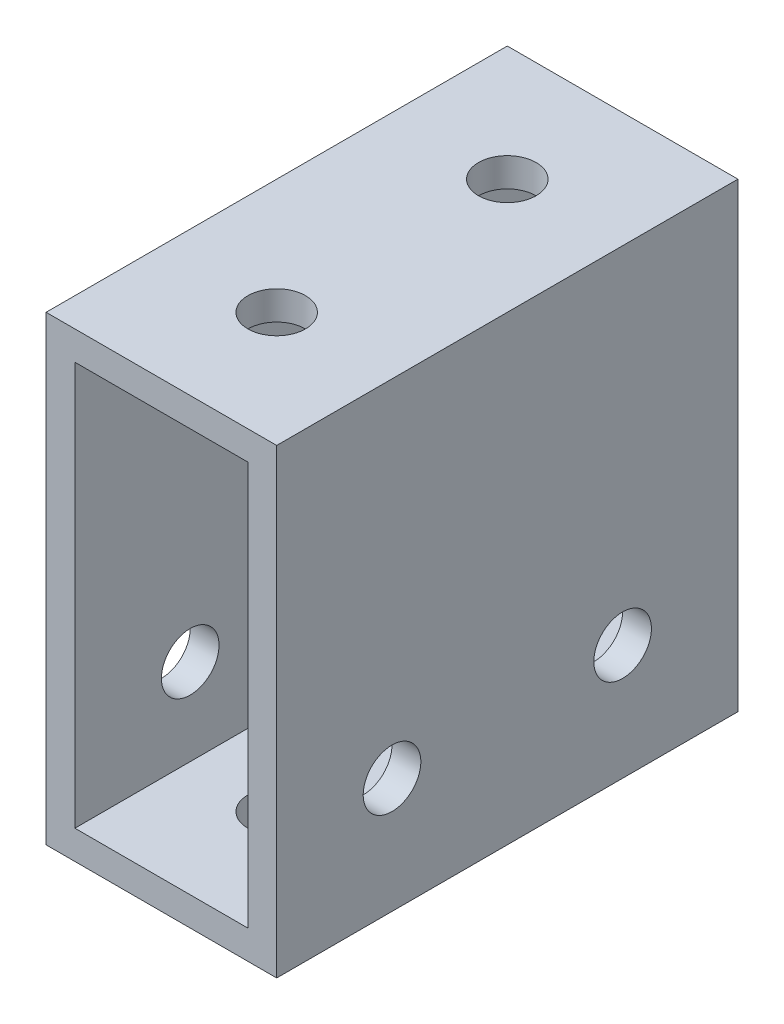
ISO-10303-21;
HEADER;
FILE_DESCRIPTION(('STEP AP214'),'2;1');
FILE_NAME('part.step','',(''),(''),'','','');
FILE_SCHEMA(('AUTOMOTIVE_DESIGN { 1 0 10303 214 1 1 1 1 }'));
ENDSEC;
DATA;
#1=APPLICATION_CONTEXT('core data for automotive mechanical design processes');
#2=APPLICATION_PROTOCOL_DEFINITION('international standard','automotive_design',2000,#1);
#3=PRODUCT_CONTEXT('',#1,'mechanical');
#4=PRODUCT('Part','Part','',(#3));
#5=PRODUCT_RELATED_PRODUCT_CATEGORY('part','',(#4));
#6=PRODUCT_DEFINITION_FORMATION('','',#4);
#7=PRODUCT_DEFINITION_CONTEXT('part definition',#1,'design');
#8=PRODUCT_DEFINITION('design','',#6,#7);
#9=PRODUCT_DEFINITION_SHAPE('','',#8);
#10=(LENGTH_UNIT() NAMED_UNIT(*) SI_UNIT(.MILLI.,.METRE.));
#11=(NAMED_UNIT(*) PLANE_ANGLE_UNIT() SI_UNIT($,.RADIAN.));
#12=(NAMED_UNIT(*) SI_UNIT($,.STERADIAN.) SOLID_ANGLE_UNIT());
#13=UNCERTAINTY_MEASURE_WITH_UNIT(LENGTH_MEASURE(1.E-05),#10,'distance_accuracy_value','');
#14=(GEOMETRIC_REPRESENTATION_CONTEXT(3) GLOBAL_UNCERTAINTY_ASSIGNED_CONTEXT((#13)) GLOBAL_UNIT_ASSIGNED_CONTEXT((#10,
#11,#12)) REPRESENTATION_CONTEXT('',''));
#15=CARTESIAN_POINT('',(0.,0.,0.));
#16=DIRECTION('',(0.,0.,1.));
#17=DIRECTION('',(1.,0.,0.));
#18=AXIS2_PLACEMENT_3D('',#15,#16,#17);
#19=CARTESIAN_POINT('',(0.,0.,50.8));
#20=DIRECTION('',(0.,0.,-1.));
#21=DIRECTION('',(-1.,0.,0.));
#22=AXIS2_PLACEMENT_3D('',#19,#20,#21);
#23=PLANE('',#22);
#24=DIRECTION('',(0.,-1.,0.));
#25=VECTOR('',#24,1.);
#26=CARTESIAN_POINT('',(0.,0.,50.8));
#27=LINE('',#26,#25);
#28=CARTESIAN_POINT('',(0.,50.8,50.8));
#29=VERTEX_POINT('',#28);
#30=CARTESIAN_POINT('',(0.,0.,50.8));
#31=VERTEX_POINT('',#30);
#32=EDGE_CURVE('E138',#29,#31,#27,.T.);
#33=ORIENTED_EDGE('',*,*,#32,.T.);
#34=DIRECTION('',(1.,0.,0.));
#35=VECTOR('',#34,1.);
#36=CARTESIAN_POINT('',(0.,0.,50.8));
#37=LINE('',#36,#35);
#38=CARTESIAN_POINT('',(25.4,0.,50.8));
#39=VERTEX_POINT('',#38);
#40=EDGE_CURVE('E141',#31,#39,#37,.T.);
#41=ORIENTED_EDGE('',*,*,#40,.T.);
#42=DIRECTION('',(0.,1.,0.));
#43=VECTOR('',#42,1.);
#44=CARTESIAN_POINT('',(25.4,0.,50.8));
#45=LINE('',#44,#43);
#46=CARTESIAN_POINT('',(25.4,50.8,50.8));
#47=VERTEX_POINT('',#46);
#48=EDGE_CURVE('E144',#39,#47,#45,.T.);
#49=ORIENTED_EDGE('',*,*,#48,.T.);
#50=DIRECTION('',(-1.,0.,0.));
#51=VECTOR('',#50,1.);
#52=CARTESIAN_POINT('',(0.,50.8,50.8));
#53=LINE('',#52,#51);
#54=EDGE_CURVE('E146',#47,#29,#53,.T.);
#55=ORIENTED_EDGE('',*,*,#54,.T.);
#56=EDGE_LOOP('',(#33,#41,#49,#55));
#57=FACE_BOUND('',#56,.T.);
#58=DIRECTION('',(0.,-1.,0.));
#59=VECTOR('',#58,1.);
#60=CARTESIAN_POINT('',(3.175,47.625,50.8));
#61=LINE('',#60,#59);
#62=CARTESIAN_POINT('',(3.175,47.625,50.8));
#63=VERTEX_POINT('',#62);
#64=CARTESIAN_POINT('',(3.17500000000001,3.175,50.8));
#65=VERTEX_POINT('',#64);
#66=EDGE_CURVE('E100',#63,#65,#61,.T.);
#67=ORIENTED_EDGE('',*,*,#66,.F.);
#68=DIRECTION('',(-1.,0.,0.));
#69=VECTOR('',#68,1.);
#70=CARTESIAN_POINT('',(3.175,47.625,50.8));
#71=LINE('',#70,#69);
#72=CARTESIAN_POINT('',(22.225,47.625,50.8));
#73=VERTEX_POINT('',#72);
#74=EDGE_CURVE('E122',#73,#63,#71,.T.);
#75=ORIENTED_EDGE('',*,*,#74,.F.);
#76=DIRECTION('',(0.,1.,0.));
#77=VECTOR('',#76,1.);
#78=CARTESIAN_POINT('',(22.225,47.625,50.8));
#79=LINE('',#78,#77);
#80=CARTESIAN_POINT('',(22.225,3.175,50.8));
#81=VERTEX_POINT('',#80);
#82=EDGE_CURVE('E120',#81,#73,#79,.T.);
#83=ORIENTED_EDGE('',*,*,#82,.F.);
#84=DIRECTION('',(1.,0.,0.));
#85=VECTOR('',#84,1.);
#86=CARTESIAN_POINT('',(3.17500000000001,3.175,50.8));
#87=LINE('',#86,#85);
#88=EDGE_CURVE('E108',#65,#81,#87,.T.);
#89=ORIENTED_EDGE('',*,*,#88,.F.);
#90=EDGE_LOOP('',(#67,#75,#83,#89));
#91=FACE_BOUND('',#90,.T.);
#92=ADVANCED_FACE('F33',(#57,#91),#23,.F.);
#93=CARTESIAN_POINT('',(0.,0.,0.));
#94=DIRECTION('',(0.,0.,-1.));
#95=DIRECTION('',(-1.,0.,0.));
#96=AXIS2_PLACEMENT_3D('',#93,#94,#95);
#97=PLANE('',#96);
#98=DIRECTION('',(0.,-1.,0.));
#99=VECTOR('',#98,1.);
#100=CARTESIAN_POINT('',(0.,0.,0.));
#101=LINE('',#100,#99);
#102=CARTESIAN_POINT('',(0.,50.8,0.));
#103=VERTEX_POINT('',#102);
#104=CARTESIAN_POINT('',(0.,0.,0.));
#105=VERTEX_POINT('',#104);
#106=EDGE_CURVE('E116',#103,#105,#101,.T.);
#107=ORIENTED_EDGE('',*,*,#106,.F.);
#108=DIRECTION('',(-1.,0.,0.));
#109=VECTOR('',#108,1.);
#110=CARTESIAN_POINT('',(0.,50.8,0.));
#111=LINE('',#110,#109);
#112=CARTESIAN_POINT('',(25.4,50.8,0.));
#113=VERTEX_POINT('',#112);
#114=EDGE_CURVE('E142',#113,#103,#111,.T.);
#115=ORIENTED_EDGE('',*,*,#114,.F.);
#116=DIRECTION('',(0.,1.,0.));
#117=VECTOR('',#116,1.);
#118=CARTESIAN_POINT('',(25.4,0.,0.));
#119=LINE('',#118,#117);
#120=CARTESIAN_POINT('',(25.4,0.,0.));
#121=VERTEX_POINT('',#120);
#122=EDGE_CURVE('E153',#121,#113,#119,.T.);
#123=ORIENTED_EDGE('',*,*,#122,.F.);
#124=DIRECTION('',(1.,0.,0.));
#125=VECTOR('',#124,1.);
#126=CARTESIAN_POINT('',(0.,0.,0.));
#127=LINE('',#126,#125);
#128=EDGE_CURVE('E151',#105,#121,#127,.T.);
#129=ORIENTED_EDGE('',*,*,#128,.F.);
#130=EDGE_LOOP('',(#107,#115,#123,#129));
#131=FACE_BOUND('',#130,.T.);
#132=DIRECTION('',(-1.,0.,0.));
#133=VECTOR('',#132,1.);
#134=CARTESIAN_POINT('',(3.175,47.625,0.));
#135=LINE('',#134,#133);
#136=CARTESIAN_POINT('',(22.225,47.625,0.));
#137=VERTEX_POINT('',#136);
#138=CARTESIAN_POINT('',(3.175,47.625,0.));
#139=VERTEX_POINT('',#138);
#140=EDGE_CURVE('E109',#137,#139,#135,.T.);
#141=ORIENTED_EDGE('',*,*,#140,.T.);
#142=DIRECTION('',(0.,-1.,0.));
#143=VECTOR('',#142,1.);
#144=CARTESIAN_POINT('',(3.175,47.625,0.));
#145=LINE('',#144,#143);
#146=CARTESIAN_POINT('',(3.17500000000001,3.175,0.));
#147=VERTEX_POINT('',#146);
#148=EDGE_CURVE('E58',#139,#147,#145,.T.);
#149=ORIENTED_EDGE('',*,*,#148,.T.);
#150=DIRECTION('',(1.,0.,0.));
#151=VECTOR('',#150,1.);
#152=CARTESIAN_POINT('',(3.17500000000001,3.175,0.));
#153=LINE('',#152,#151);
#154=CARTESIAN_POINT('',(22.225,3.175,0.));
#155=VERTEX_POINT('',#154);
#156=EDGE_CURVE('E115',#147,#155,#153,.T.);
#157=ORIENTED_EDGE('',*,*,#156,.T.);
#158=DIRECTION('',(0.,1.,0.));
#159=VECTOR('',#158,1.);
#160=CARTESIAN_POINT('',(22.225,47.625,0.));
#161=LINE('',#160,#159);
#162=EDGE_CURVE('E130',#155,#137,#161,.T.);
#163=ORIENTED_EDGE('',*,*,#162,.T.);
#164=EDGE_LOOP('',(#141,#149,#157,#163));
#165=FACE_BOUND('',#164,.T.);
#166=ADVANCED_FACE('F225',(#131,#165),#97,.T.);
#167=CARTESIAN_POINT('',(0.,0.,50.8));
#168=DIRECTION('',(1.,0.,0.));
#169=DIRECTION('',(0.,0.,-1.));
#170=AXIS2_PLACEMENT_3D('',#167,#168,#169);
#171=PLANE('',#170);
#172=CARTESIAN_POINT('',(0.,12.7,12.7));
#173=DIRECTION('',(-1.,0.,0.));
#174=DIRECTION('',(0.,0.,1.));
#175=AXIS2_PLACEMENT_3D('',#172,#173,#174);
#176=CIRCLE('',#175,3.175);
#177=CARTESIAN_POINT('',(0.,12.7,15.875));
#178=VERTEX_POINT('',#177);
#179=EDGE_CURVE('E304',#178,#178,#176,.T.);
#180=ORIENTED_EDGE('',*,*,#179,.F.);
#181=EDGE_LOOP('',(#180));
#182=FACE_BOUND('',#181,.T.);
#183=CARTESIAN_POINT('',(0.,12.7,38.1));
#184=DIRECTION('',(-1.,0.,0.));
#185=DIRECTION('',(0.,0.,1.));
#186=AXIS2_PLACEMENT_3D('',#183,#184,#185);
#187=CIRCLE('',#186,3.175);
#188=CARTESIAN_POINT('',(0.,12.7,41.275));
#189=VERTEX_POINT('',#188);
#190=EDGE_CURVE('E174',#189,#189,#187,.T.);
#191=ORIENTED_EDGE('',*,*,#190,.F.);
#192=EDGE_LOOP('',(#191));
#193=FACE_BOUND('',#192,.T.);
#194=ORIENTED_EDGE('',*,*,#106,.T.);
#195=DIRECTION('',(0.,0.,-1.));
#196=VECTOR('',#195,1.);
#197=CARTESIAN_POINT('',(0.,0.,50.8));
#198=LINE('',#197,#196);
#199=EDGE_CURVE('E11',#31,#105,#198,.T.);
#200=ORIENTED_EDGE('',*,*,#199,.F.);
#201=ORIENTED_EDGE('',*,*,#32,.F.);
#202=DIRECTION('',(0.,0.,-1.));
#203=VECTOR('',#202,1.);
#204=CARTESIAN_POINT('',(0.,50.8,50.8));
#205=LINE('',#204,#203);
#206=EDGE_CURVE('E148',#29,#103,#205,.T.);
#207=ORIENTED_EDGE('',*,*,#206,.T.);
#208=EDGE_LOOP('',(#194,#200,#201,#207));
#209=FACE_BOUND('',#208,.T.);
#210=ADVANCED_FACE('F35',(#182,#193,#209),#171,.F.);
#211=CARTESIAN_POINT('',(0.,0.,50.8));
#212=DIRECTION('',(0.,1.,0.));
#213=DIRECTION('',(0.,0.,1.));
#214=AXIS2_PLACEMENT_3D('',#211,#212,#213);
#215=PLANE('',#214);
#216=CARTESIAN_POINT('',(12.7,0.,12.7));
#217=DIRECTION('',(0.,-1.,0.));
#218=DIRECTION('',(0.,0.,-1.));
#219=AXIS2_PLACEMENT_3D('',#216,#217,#218);
#220=CIRCLE('',#219,3.175);
#221=CARTESIAN_POINT('',(12.7,0.,9.525));
#222=VERTEX_POINT('',#221);
#223=EDGE_CURVE('E192',#222,#222,#220,.T.);
#224=ORIENTED_EDGE('',*,*,#223,.F.);
#225=EDGE_LOOP('',(#224));
#226=FACE_BOUND('',#225,.T.);
#227=CARTESIAN_POINT('',(12.7,0.,38.1));
#228=DIRECTION('',(0.,-1.,0.));
#229=DIRECTION('',(0.,0.,-1.));
#230=AXIS2_PLACEMENT_3D('',#227,#228,#229);
#231=CIRCLE('',#230,3.175);
#232=CARTESIAN_POINT('',(12.7,0.,34.925));
#233=VERTEX_POINT('',#232);
#234=EDGE_CURVE('E199',#233,#233,#231,.T.);
#235=ORIENTED_EDGE('',*,*,#234,.F.);
#236=EDGE_LOOP('',(#235));
#237=FACE_BOUND('',#236,.T.);
#238=ORIENTED_EDGE('',*,*,#128,.T.);
#239=DIRECTION('',(0.,0.,-1.));
#240=VECTOR('',#239,1.);
#241=CARTESIAN_POINT('',(25.4,0.,50.8));
#242=LINE('',#241,#240);
#243=EDGE_CURVE('E42',#39,#121,#242,.T.);
#244=ORIENTED_EDGE('',*,*,#243,.F.);
#245=ORIENTED_EDGE('',*,*,#40,.F.);
#246=ORIENTED_EDGE('',*,*,#199,.T.);
#247=EDGE_LOOP('',(#238,#244,#245,#246));
#248=FACE_BOUND('',#247,.T.);
#249=ADVANCED_FACE('F239',(#226,#237,#248),#215,.F.);
#250=CARTESIAN_POINT('',(25.4,0.,50.8));
#251=DIRECTION('',(-1.,0.,0.));
#252=DIRECTION('',(0.,0.,1.));
#253=AXIS2_PLACEMENT_3D('',#250,#251,#252);
#254=PLANE('',#253);
#255=CARTESIAN_POINT('',(25.4,12.7,12.7));
#256=DIRECTION('',(-1.,0.,0.));
#257=DIRECTION('',(0.,0.,1.));
#258=AXIS2_PLACEMENT_3D('',#255,#256,#257);
#259=CIRCLE('',#258,3.175);
#260=CARTESIAN_POINT('',(25.4,12.7,15.875));
#261=VERTEX_POINT('',#260);
#262=EDGE_CURVE('E181',#261,#261,#259,.T.);
#263=ORIENTED_EDGE('',*,*,#262,.T.);
#264=EDGE_LOOP('',(#263));
#265=FACE_BOUND('',#264,.T.);
#266=CARTESIAN_POINT('',(25.4,12.7,38.1));
#267=DIRECTION('',(-1.,0.,0.));
#268=DIRECTION('',(0.,0.,1.));
#269=AXIS2_PLACEMENT_3D('',#266,#267,#268);
#270=CIRCLE('',#269,3.175);
#271=CARTESIAN_POINT('',(25.4,12.7,41.275));
#272=VERTEX_POINT('',#271);
#273=EDGE_CURVE('E178',#272,#272,#270,.T.);
#274=ORIENTED_EDGE('',*,*,#273,.T.);
#275=EDGE_LOOP('',(#274));
#276=FACE_BOUND('',#275,.T.);
#277=ORIENTED_EDGE('',*,*,#122,.T.);
#278=DIRECTION('',(0.,0.,-1.));
#279=VECTOR('',#278,1.);
#280=CARTESIAN_POINT('',(25.4,50.8,50.8));
#281=LINE('',#280,#279);
#282=EDGE_CURVE('E158',#47,#113,#281,.T.);
#283=ORIENTED_EDGE('',*,*,#282,.F.);
#284=ORIENTED_EDGE('',*,*,#48,.F.);
#285=ORIENTED_EDGE('',*,*,#243,.T.);
#286=EDGE_LOOP('',(#277,#283,#284,#285));
#287=FACE_BOUND('',#286,.T.);
#288=ADVANCED_FACE('F236',(#265,#276,#287),#254,.F.);
#289=CARTESIAN_POINT('',(0.,50.8,50.8));
#290=DIRECTION('',(0.,-1.,0.));
#291=DIRECTION('',(0.,0.,-1.));
#292=AXIS2_PLACEMENT_3D('',#289,#290,#291);
#293=PLANE('',#292);
#294=CARTESIAN_POINT('',(12.7,50.8,12.7));
#295=DIRECTION('',(0.,-1.,0.));
#296=DIRECTION('',(0.,0.,-1.));
#297=AXIS2_PLACEMENT_3D('',#294,#295,#296);
#298=CIRCLE('',#297,3.175);
#299=CARTESIAN_POINT('',(12.7,50.8,9.525));
#300=VERTEX_POINT('',#299);
#301=EDGE_CURVE('E170',#300,#300,#298,.T.);
#302=ORIENTED_EDGE('',*,*,#301,.T.);
#303=EDGE_LOOP('',(#302));
#304=FACE_BOUND('',#303,.T.);
#305=CARTESIAN_POINT('',(12.7,50.8,38.1));
#306=DIRECTION('',(0.,-1.,0.));
#307=DIRECTION('',(0.,0.,-1.));
#308=AXIS2_PLACEMENT_3D('',#305,#306,#307);
#309=CIRCLE('',#308,3.175);
#310=CARTESIAN_POINT('',(12.7,50.8,34.925));
#311=VERTEX_POINT('',#310);
#312=EDGE_CURVE('E166',#311,#311,#309,.T.);
#313=ORIENTED_EDGE('',*,*,#312,.T.);
#314=EDGE_LOOP('',(#313));
#315=FACE_BOUND('',#314,.T.);
#316=ORIENTED_EDGE('',*,*,#114,.T.);
#317=ORIENTED_EDGE('',*,*,#206,.F.);
#318=ORIENTED_EDGE('',*,*,#54,.F.);
#319=ORIENTED_EDGE('',*,*,#282,.T.);
#320=EDGE_LOOP('',(#316,#317,#318,#319));
#321=FACE_BOUND('',#320,.T.);
#322=ADVANCED_FACE('F220',(#304,#315,#321),#293,.F.);
#323=CARTESIAN_POINT('',(3.175,47.625,50.8));
#324=DIRECTION('',(1.,0.,0.));
#325=DIRECTION('',(0.,1.,0.));
#326=AXIS2_PLACEMENT_3D('',#323,#324,#325);
#327=PLANE('',#326);
#328=CARTESIAN_POINT('',(3.175,12.7,12.7));
#329=DIRECTION('',(1.,0.,0.));
#330=DIRECTION('',(0.,1.,0.));
#331=AXIS2_PLACEMENT_3D('',#328,#329,#330);
#332=CIRCLE('',#331,3.175);
#333=CARTESIAN_POINT('',(3.175,15.875,12.7));
#334=VERTEX_POINT('',#333);
#335=EDGE_CURVE('E186',#334,#334,#332,.T.);
#336=ORIENTED_EDGE('',*,*,#335,.F.);
#337=EDGE_LOOP('',(#336));
#338=FACE_BOUND('',#337,.T.);
#339=CARTESIAN_POINT('',(3.175,12.7,38.1));
#340=DIRECTION('',(1.,0.,0.));
#341=DIRECTION('',(0.,1.,0.));
#342=AXIS2_PLACEMENT_3D('',#339,#340,#341);
#343=CIRCLE('',#342,3.175);
#344=CARTESIAN_POINT('',(3.175,15.875,38.1));
#345=VERTEX_POINT('',#344);
#346=EDGE_CURVE('E173',#345,#345,#343,.T.);
#347=ORIENTED_EDGE('',*,*,#346,.F.);
#348=EDGE_LOOP('',(#347));
#349=FACE_BOUND('',#348,.T.);
#350=ORIENTED_EDGE('',*,*,#148,.F.);
#351=DIRECTION('',(0.,0.,-1.));
#352=VECTOR('',#351,1.);
#353=CARTESIAN_POINT('',(3.175,47.625,50.8));
#354=LINE('',#353,#352);
#355=EDGE_CURVE('E104',#63,#139,#354,.T.);
#356=ORIENTED_EDGE('',*,*,#355,.F.);
#357=ORIENTED_EDGE('',*,*,#66,.T.);
#358=DIRECTION('',(0.,0.,-1.));
#359=VECTOR('',#358,1.);
#360=CARTESIAN_POINT('',(3.17500000000001,3.175,50.8));
#361=LINE('',#360,#359);
#362=EDGE_CURVE('E103',#65,#147,#361,.T.);
#363=ORIENTED_EDGE('',*,*,#362,.T.);
#364=EDGE_LOOP('',(#350,#356,#357,#363));
#365=FACE_BOUND('',#364,.T.);
#366=ADVANCED_FACE('F102',(#338,#349,#365),#327,.T.);
#367=CARTESIAN_POINT('',(3.17500000000001,3.175,50.8));
#368=DIRECTION('',(0.,1.,0.));
#369=DIRECTION('',(0.,0.,1.));
#370=AXIS2_PLACEMENT_3D('',#367,#368,#369);
#371=PLANE('',#370);
#372=CARTESIAN_POINT('',(12.7,3.175,12.7));
#373=DIRECTION('',(0.,1.,0.));
#374=DIRECTION('',(0.,0.,1.));
#375=AXIS2_PLACEMENT_3D('',#372,#373,#374);
#376=CIRCLE('',#375,3.175);
#377=CARTESIAN_POINT('',(12.7,3.175,15.875));
#378=VERTEX_POINT('',#377);
#379=EDGE_CURVE('E169',#378,#378,#376,.T.);
#380=ORIENTED_EDGE('',*,*,#379,.F.);
#381=EDGE_LOOP('',(#380));
#382=FACE_BOUND('',#381,.T.);
#383=CARTESIAN_POINT('',(12.7,3.175,38.1));
#384=DIRECTION('',(0.,1.,0.));
#385=DIRECTION('',(0.,0.,1.));
#386=AXIS2_PLACEMENT_3D('',#383,#384,#385);
#387=CIRCLE('',#386,3.175);
#388=CARTESIAN_POINT('',(12.7,3.175,41.275));
#389=VERTEX_POINT('',#388);
#390=EDGE_CURVE('E128',#389,#389,#387,.T.);
#391=ORIENTED_EDGE('',*,*,#390,.F.);
#392=EDGE_LOOP('',(#391));
#393=FACE_BOUND('',#392,.T.);
#394=ORIENTED_EDGE('',*,*,#156,.F.);
#395=ORIENTED_EDGE('',*,*,#362,.F.);
#396=ORIENTED_EDGE('',*,*,#88,.T.);
#397=DIRECTION('',(0.,0.,-1.));
#398=VECTOR('',#397,1.);
#399=CARTESIAN_POINT('',(22.225,3.175,50.8));
#400=LINE('',#399,#398);
#401=EDGE_CURVE('E117',#81,#155,#400,.T.);
#402=ORIENTED_EDGE('',*,*,#401,.T.);
#403=EDGE_LOOP('',(#394,#395,#396,#402));
#404=FACE_BOUND('',#403,.T.);
#405=ADVANCED_FACE('F112',(#382,#393,#404),#371,.T.);
#406=CARTESIAN_POINT('',(22.225,47.625,50.8));
#407=DIRECTION('',(-1.,0.,0.));
#408=DIRECTION('',(0.,-1.,0.));
#409=AXIS2_PLACEMENT_3D('',#406,#407,#408);
#410=PLANE('',#409);
#411=CARTESIAN_POINT('',(22.225,12.7,12.7));
#412=DIRECTION('',(-1.,0.,0.));
#413=DIRECTION('',(0.,-1.,0.));
#414=AXIS2_PLACEMENT_3D('',#411,#412,#413);
#415=CIRCLE('',#414,3.175);
#416=CARTESIAN_POINT('',(22.225,9.525,12.7));
#417=VERTEX_POINT('',#416);
#418=EDGE_CURVE('E37',#417,#417,#415,.T.);
#419=ORIENTED_EDGE('',*,*,#418,.F.);
#420=EDGE_LOOP('',(#419));
#421=FACE_BOUND('',#420,.T.);
#422=CARTESIAN_POINT('',(22.225,12.7,38.1));
#423=DIRECTION('',(-1.,0.,0.));
#424=DIRECTION('',(0.,-1.,0.));
#425=AXIS2_PLACEMENT_3D('',#422,#423,#424);
#426=CIRCLE('',#425,3.175);
#427=CARTESIAN_POINT('',(22.225,9.52500000000001,38.1));
#428=VERTEX_POINT('',#427);
#429=EDGE_CURVE('E171',#428,#428,#426,.T.);
#430=ORIENTED_EDGE('',*,*,#429,.F.);
#431=EDGE_LOOP('',(#430));
#432=FACE_BOUND('',#431,.T.);
#433=ORIENTED_EDGE('',*,*,#162,.F.);
#434=ORIENTED_EDGE('',*,*,#401,.F.);
#435=ORIENTED_EDGE('',*,*,#82,.T.);
#436=DIRECTION('',(0.,0.,-1.));
#437=VECTOR('',#436,1.);
#438=CARTESIAN_POINT('',(22.225,47.625,50.8));
#439=LINE('',#438,#437);
#440=EDGE_CURVE('E50',#73,#137,#439,.T.);
#441=ORIENTED_EDGE('',*,*,#440,.T.);
#442=EDGE_LOOP('',(#433,#434,#435,#441));
#443=FACE_BOUND('',#442,.T.);
#444=ADVANCED_FACE('F210',(#421,#432,#443),#410,.T.);
#445=CARTESIAN_POINT('',(3.175,47.625,50.8));
#446=DIRECTION('',(0.,-1.,0.));
#447=DIRECTION('',(0.,0.,-1.));
#448=AXIS2_PLACEMENT_3D('',#445,#446,#447);
#449=PLANE('',#448);
#450=CARTESIAN_POINT('',(12.7,47.625,12.7));
#451=DIRECTION('',(0.,-1.,0.));
#452=DIRECTION('',(0.,0.,-1.));
#453=AXIS2_PLACEMENT_3D('',#450,#451,#452);
#454=CIRCLE('',#453,3.175);
#455=CARTESIAN_POINT('',(12.7,47.625,9.525));
#456=VERTEX_POINT('',#455);
#457=EDGE_CURVE('E167',#456,#456,#454,.T.);
#458=ORIENTED_EDGE('',*,*,#457,.F.);
#459=EDGE_LOOP('',(#458));
#460=FACE_BOUND('',#459,.T.);
#461=CARTESIAN_POINT('',(12.7,47.625,38.1));
#462=DIRECTION('',(0.,-1.,0.));
#463=DIRECTION('',(0.,0.,-1.));
#464=AXIS2_PLACEMENT_3D('',#461,#462,#463);
#465=CIRCLE('',#464,3.175);
#466=CARTESIAN_POINT('',(12.7,47.625,34.925));
#467=VERTEX_POINT('',#466);
#468=EDGE_CURVE('E163',#467,#467,#465,.T.);
#469=ORIENTED_EDGE('',*,*,#468,.F.);
#470=EDGE_LOOP('',(#469));
#471=FACE_BOUND('',#470,.T.);
#472=ORIENTED_EDGE('',*,*,#140,.F.);
#473=ORIENTED_EDGE('',*,*,#440,.F.);
#474=ORIENTED_EDGE('',*,*,#74,.T.);
#475=ORIENTED_EDGE('',*,*,#355,.T.);
#476=EDGE_LOOP('',(#472,#473,#474,#475));
#477=FACE_BOUND('',#476,.T.);
#478=ADVANCED_FACE('F217',(#460,#471,#477),#449,.T.);
#479=CARTESIAN_POINT('',(12.7,50.8,38.1));
#480=DIRECTION('',(0.,-1.,0.));
#481=DIRECTION('',(0.,0.,-1.));
#482=AXIS2_PLACEMENT_3D('',#479,#480,#481);
#483=CYLINDRICAL_SURFACE('',#482,3.175);
#484=ORIENTED_EDGE('',*,*,#468,.T.);
#485=EDGE_LOOP('',(#484));
#486=FACE_BOUND('',#485,.T.);
#487=ORIENTED_EDGE('',*,*,#312,.F.);
#488=EDGE_LOOP('',(#487));
#489=FACE_BOUND('',#488,.T.);
#490=ADVANCED_FACE('F267',(#486,#489),#483,.F.);
#491=ORIENTED_EDGE('',*,*,#390,.T.);
#492=EDGE_LOOP('',(#491));
#493=FACE_BOUND('',#492,.T.);
#494=ORIENTED_EDGE('',*,*,#234,.T.);
#495=EDGE_LOOP('',(#494));
#496=FACE_BOUND('',#495,.T.);
#497=ADVANCED_FACE('F206',(#493,#496),#483,.F.);
#498=CARTESIAN_POINT('',(12.7,50.8,12.7));
#499=DIRECTION('',(0.,-1.,0.));
#500=DIRECTION('',(0.,0.,-1.));
#501=AXIS2_PLACEMENT_3D('',#498,#499,#500);
#502=CYLINDRICAL_SURFACE('',#501,3.175);
#503=ORIENTED_EDGE('',*,*,#457,.T.);
#504=EDGE_LOOP('',(#503));
#505=FACE_BOUND('',#504,.T.);
#506=ORIENTED_EDGE('',*,*,#301,.F.);
#507=EDGE_LOOP('',(#506));
#508=FACE_BOUND('',#507,.T.);
#509=ADVANCED_FACE('F278',(#505,#508),#502,.F.);
#510=ORIENTED_EDGE('',*,*,#379,.T.);
#511=EDGE_LOOP('',(#510));
#512=FACE_BOUND('',#511,.T.);
#513=ORIENTED_EDGE('',*,*,#223,.T.);
#514=EDGE_LOOP('',(#513));
#515=FACE_BOUND('',#514,.T.);
#516=ADVANCED_FACE('F281',(#512,#515),#502,.F.);
#517=CARTESIAN_POINT('',(50.8,12.7,38.1));
#518=DIRECTION('',(-1.,0.,0.));
#519=DIRECTION('',(0.,0.,1.));
#520=AXIS2_PLACEMENT_3D('',#517,#518,#519);
#521=CYLINDRICAL_SURFACE('',#520,3.175);
#522=ORIENTED_EDGE('',*,*,#429,.T.);
#523=EDGE_LOOP('',(#522));
#524=FACE_BOUND('',#523,.T.);
#525=ORIENTED_EDGE('',*,*,#273,.F.);
#526=EDGE_LOOP('',(#525));
#527=FACE_BOUND('',#526,.T.);
#528=ADVANCED_FACE('F283',(#524,#527),#521,.F.);
#529=ORIENTED_EDGE('',*,*,#346,.T.);
#530=EDGE_LOOP('',(#529));
#531=FACE_BOUND('',#530,.T.);
#532=ORIENTED_EDGE('',*,*,#190,.T.);
#533=EDGE_LOOP('',(#532));
#534=FACE_BOUND('',#533,.T.);
#535=ADVANCED_FACE('F286',(#531,#534),#521,.F.);
#536=CARTESIAN_POINT('',(50.8,12.7,12.7));
#537=DIRECTION('',(-1.,0.,0.));
#538=DIRECTION('',(0.,0.,1.));
#539=AXIS2_PLACEMENT_3D('',#536,#537,#538);
#540=CYLINDRICAL_SURFACE('',#539,3.175);
#541=ORIENTED_EDGE('',*,*,#418,.T.);
#542=EDGE_LOOP('',(#541));
#543=FACE_BOUND('',#542,.T.);
#544=ORIENTED_EDGE('',*,*,#262,.F.);
#545=EDGE_LOOP('',(#544));
#546=FACE_BOUND('',#545,.T.);
#547=ADVANCED_FACE('F287',(#543,#546),#540,.F.);
#548=ORIENTED_EDGE('',*,*,#335,.T.);
#549=EDGE_LOOP('',(#548));
#550=FACE_BOUND('',#549,.T.);
#551=ORIENTED_EDGE('',*,*,#179,.T.);
#552=EDGE_LOOP('',(#551));
#553=FACE_BOUND('',#552,.T.);
#554=ADVANCED_FACE('F289',(#550,#553),#540,.F.);
#555=CLOSED_SHELL('',(#92,#166,#210,#249,#288,#322,#366,#405,#444,#478,#490,#497,#509,#516,#528,
#535,#547,#554));
#556=MANIFOLD_SOLID_BREP('B2',#555);
#557=ADVANCED_BREP_SHAPE_REPRESENTATION('',(#18,#556),#14);
#558=SHAPE_DEFINITION_REPRESENTATION(#9,#557);
ENDSEC;
END-ISO-10303-21;
